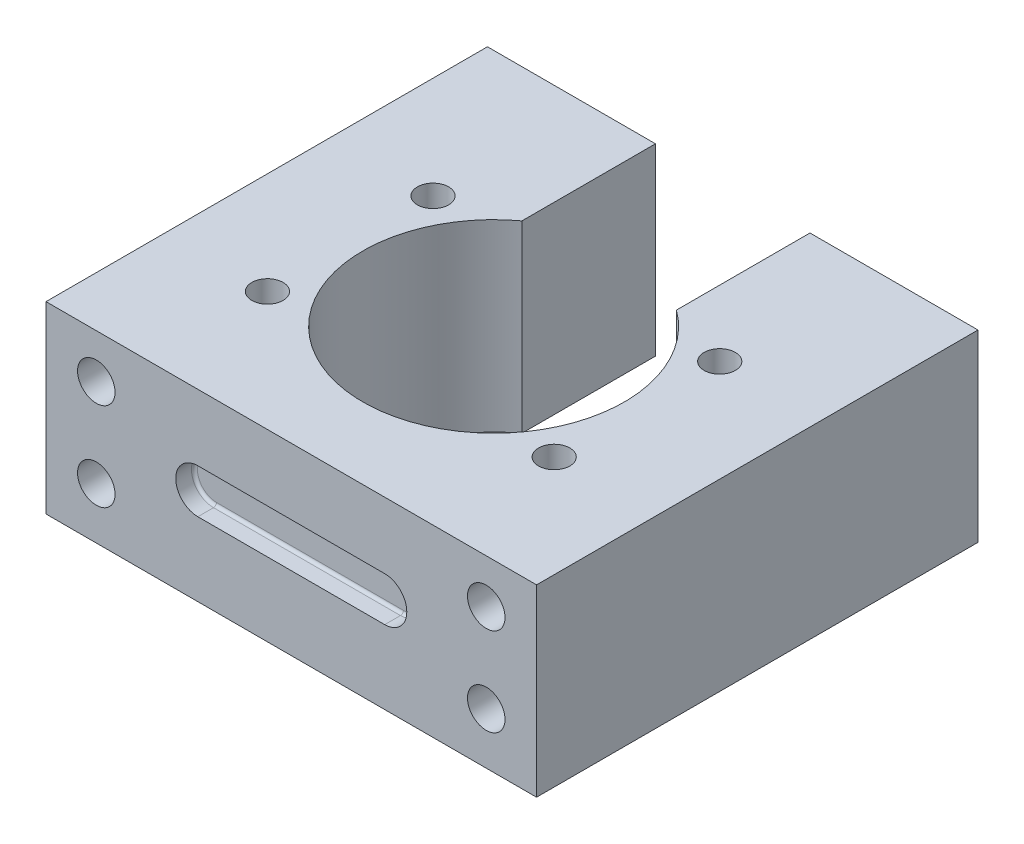
ISO-10303-21;
HEADER;
FILE_DESCRIPTION(('STEP AP214'),'2;1');
FILE_NAME('part.step','',(''),(''),'','','');
FILE_SCHEMA(('AUTOMOTIVE_DESIGN { 1 0 10303 214 1 1 1 1 }'));
ENDSEC;
DATA;
#1=APPLICATION_CONTEXT('core data for automotive mechanical design processes');
#2=APPLICATION_PROTOCOL_DEFINITION('international standard','automotive_design',2000,#1);
#3=PRODUCT_CONTEXT('',#1,'mechanical');
#4=PRODUCT('Part','Part','',(#3));
#5=PRODUCT_RELATED_PRODUCT_CATEGORY('part','',(#4));
#6=PRODUCT_DEFINITION_FORMATION('','',#4);
#7=PRODUCT_DEFINITION_CONTEXT('part definition',#1,'design');
#8=PRODUCT_DEFINITION('design','',#6,#7);
#9=PRODUCT_DEFINITION_SHAPE('','',#8);
#10=(LENGTH_UNIT() NAMED_UNIT(*) SI_UNIT(.MILLI.,.METRE.));
#11=(NAMED_UNIT(*) PLANE_ANGLE_UNIT() SI_UNIT($,.RADIAN.));
#12=(NAMED_UNIT(*) SI_UNIT($,.STERADIAN.) SOLID_ANGLE_UNIT());
#13=UNCERTAINTY_MEASURE_WITH_UNIT(LENGTH_MEASURE(1.E-05),#10,'distance_accuracy_value','');
#14=(GEOMETRIC_REPRESENTATION_CONTEXT(3) GLOBAL_UNCERTAINTY_ASSIGNED_CONTEXT((#13)) GLOBAL_UNIT_ASSIGNED_CONTEXT((#10,
#11,#12)) REPRESENTATION_CONTEXT('',''));
#15=CARTESIAN_POINT('',(0.,0.,0.));
#16=DIRECTION('',(0.,0.,1.));
#17=DIRECTION('',(1.,0.,0.));
#18=AXIS2_PLACEMENT_3D('',#15,#16,#17);
#19=CARTESIAN_POINT('',(0.,28.575,-120.));
#20=DIRECTION('',(0.,0.,-1.));
#21=DIRECTION('',(-1.,0.,0.));
#22=AXIS2_PLACEMENT_3D('',#19,#20,#21);
#23=PLANE('',#22);
#24=DIRECTION('',(0.,1.,0.));
#25=VECTOR('',#24,1.);
#26=CARTESIAN_POINT('',(-21.,-28.575,-120.));
#27=LINE('',#26,#25);
#28=CARTESIAN_POINT('',(-21.,-28.575,-120.));
#29=VERTEX_POINT('',#28);
#30=CARTESIAN_POINT('',(-21.,21.425,-120.));
#31=VERTEX_POINT('',#30);
#32=EDGE_CURVE('E258',#29,#31,#27,.T.);
#33=ORIENTED_EDGE('',*,*,#32,.F.);
#34=DIRECTION('',(1.,0.,0.));
#35=VECTOR('',#34,1.);
#36=CARTESIAN_POINT('',(0.,-28.575,-120.));
#37=LINE('',#36,#35);
#38=CARTESIAN_POINT('',(-66.675,-28.575,-120.));
#39=VERTEX_POINT('',#38);
#40=EDGE_CURVE('E296',#39,#29,#37,.T.);
#41=ORIENTED_EDGE('',*,*,#40,.F.);
#42=DIRECTION('',(0.,-1.,0.));
#43=VECTOR('',#42,1.);
#44=CARTESIAN_POINT('',(-66.675,28.575,-120.));
#45=LINE('',#44,#43);
#46=CARTESIAN_POINT('',(-66.675,21.425,-120.));
#47=VERTEX_POINT('',#46);
#48=EDGE_CURVE('E302',#47,#39,#45,.T.);
#49=ORIENTED_EDGE('',*,*,#48,.F.);
#50=DIRECTION('',(1.,0.,0.));
#51=VECTOR('',#50,1.);
#52=CARTESIAN_POINT('',(-66.675,21.425,-120.));
#53=LINE('',#52,#51);
#54=EDGE_CURVE('E280',#47,#31,#53,.T.);
#55=ORIENTED_EDGE('',*,*,#54,.T.);
#56=EDGE_LOOP('',(#33,#41,#49,#55));
#57=FACE_BOUND('',#56,.T.);
#58=ADVANCED_FACE('F40',(#57),#23,.T.);
#59=CARTESIAN_POINT('',(66.675,28.575,0.));
#60=DIRECTION('',(1.,0.,0.));
#61=DIRECTION('',(0.,0.,-1.));
#62=AXIS2_PLACEMENT_3D('',#59,#60,#61);
#63=PLANE('',#62);
#64=DIRECTION('',(0.,0.,-1.));
#65=VECTOR('',#64,1.);
#66=CARTESIAN_POINT('',(66.675,21.425,0.));
#67=LINE('',#66,#65);
#68=CARTESIAN_POINT('',(66.675,21.425,0.));
#69=VERTEX_POINT('',#68);
#70=CARTESIAN_POINT('',(66.675,21.425,-120.));
#71=VERTEX_POINT('',#70);
#72=EDGE_CURVE('E271',#69,#71,#67,.T.);
#73=ORIENTED_EDGE('',*,*,#72,.F.);
#74=DIRECTION('',(0.,-1.,0.));
#75=VECTOR('',#74,1.);
#76=CARTESIAN_POINT('',(66.675,28.575,0.));
#77=LINE('',#76,#75);
#78=CARTESIAN_POINT('',(66.675,-28.575,0.));
#79=VERTEX_POINT('',#78);
#80=EDGE_CURVE('E290',#69,#79,#77,.T.);
#81=ORIENTED_EDGE('',*,*,#80,.T.);
#82=DIRECTION('',(0.,0.,1.));
#83=VECTOR('',#82,1.);
#84=CARTESIAN_POINT('',(66.675,-28.575,0.));
#85=LINE('',#84,#83);
#86=CARTESIAN_POINT('',(66.675,-28.575,-120.));
#87=VERTEX_POINT('',#86);
#88=EDGE_CURVE('E292',#87,#79,#85,.T.);
#89=ORIENTED_EDGE('',*,*,#88,.F.);
#90=DIRECTION('',(0.,-1.,0.));
#91=VECTOR('',#90,1.);
#92=CARTESIAN_POINT('',(66.675,28.575,-120.));
#93=LINE('',#92,#91);
#94=EDGE_CURVE('E304',#71,#87,#93,.T.);
#95=ORIENTED_EDGE('',*,*,#94,.F.);
#96=EDGE_LOOP('',(#73,#81,#89,#95));
#97=FACE_BOUND('',#96,.T.);
#98=ADVANCED_FACE('F351',(#97),#63,.T.);
#99=DIRECTION('',(0.,1.,0.));
#100=VECTOR('',#99,1.);
#101=CARTESIAN_POINT('',(21.,-28.575,-120.));
#102=LINE('',#101,#100);
#103=CARTESIAN_POINT('',(21.,-28.575,-120.));
#104=VERTEX_POINT('',#103);
#105=CARTESIAN_POINT('',(21.,21.425,-120.));
#106=VERTEX_POINT('',#105);
#107=EDGE_CURVE('E261',#104,#106,#102,.T.);
#108=ORIENTED_EDGE('',*,*,#107,.T.);
#109=EDGE_CURVE('E284',#106,#71,#53,.T.);
#110=ORIENTED_EDGE('',*,*,#109,.T.);
#111=ORIENTED_EDGE('',*,*,#94,.T.);
#112=EDGE_CURVE('E295',#104,#87,#37,.T.);
#113=ORIENTED_EDGE('',*,*,#112,.F.);
#114=EDGE_LOOP('',(#108,#110,#111,#113));
#115=FACE_BOUND('',#114,.T.);
#116=ADVANCED_FACE('F354',(#115),#23,.T.);
#117=CARTESIAN_POINT('',(-66.675,28.575,0.));
#118=DIRECTION('',(1.,0.,0.));
#119=DIRECTION('',(0.,0.,-1.));
#120=AXIS2_PLACEMENT_3D('',#117,#118,#119);
#121=PLANE('',#120);
#122=DIRECTION('',(0.,-1.,0.));
#123=VECTOR('',#122,1.);
#124=CARTESIAN_POINT('',(-66.675,28.575,0.));
#125=LINE('',#124,#123);
#126=CARTESIAN_POINT('',(-66.675,21.425,0.));
#127=VERTEX_POINT('',#126);
#128=CARTESIAN_POINT('',(-66.675,-28.575,0.));
#129=VERTEX_POINT('',#128);
#130=EDGE_CURVE('E288',#127,#129,#125,.T.);
#131=ORIENTED_EDGE('',*,*,#130,.F.);
#132=DIRECTION('',(0.,0.,-1.));
#133=VECTOR('',#132,1.);
#134=CARTESIAN_POINT('',(-66.675,21.425,0.));
#135=LINE('',#134,#133);
#136=EDGE_CURVE('E274',#127,#47,#135,.T.);
#137=ORIENTED_EDGE('',*,*,#136,.T.);
#138=ORIENTED_EDGE('',*,*,#48,.T.);
#139=DIRECTION('',(0.,0.,1.));
#140=VECTOR('',#139,1.);
#141=CARTESIAN_POINT('',(-66.675,-28.575,0.));
#142=LINE('',#141,#140);
#143=EDGE_CURVE('E299',#39,#129,#142,.T.);
#144=ORIENTED_EDGE('',*,*,#143,.T.);
#145=EDGE_LOOP('',(#131,#137,#138,#144));
#146=FACE_BOUND('',#145,.T.);
#147=ADVANCED_FACE('F363',(#146),#121,.F.);
#148=CARTESIAN_POINT('',(0.,-28.575,0.));
#149=DIRECTION('',(0.,1.,0.));
#150=DIRECTION('',(0.,0.,1.));
#151=AXIS2_PLACEMENT_3D('',#148,#149,#150);
#152=PLANE('',#151);
#153=ORIENTED_EDGE('',*,*,#40,.T.);
#154=DIRECTION('',(0.,0.,1.));
#155=VECTOR('',#154,1.);
#156=CARTESIAN_POINT('',(-21.,-28.575,-120.));
#157=LINE('',#156,#155);
#158=CARTESIAN_POINT('',(-21.,-28.575,-83.6969266647145));
#159=VERTEX_POINT('',#158);
#160=EDGE_CURVE('E248',#29,#159,#157,.T.);
#161=ORIENTED_EDGE('',*,*,#160,.T.);
#162=CARTESIAN_POINT('',(0.,-28.575,-55.));
#163=DIRECTION('',(0.,1.,0.));
#164=DIRECTION('',(0.,0.,1.));
#165=AXIS2_PLACEMENT_3D('',#162,#163,#164);
#166=CIRCLE('',#165,35.56);
#167=CARTESIAN_POINT('',(21.,-28.575,-83.6969266647145));
#168=VERTEX_POINT('',#167);
#169=EDGE_CURVE('E268',#159,#168,#166,.T.);
#170=ORIENTED_EDGE('',*,*,#169,.T.);
#171=DIRECTION('',(0.,0.,-1.));
#172=VECTOR('',#171,1.);
#173=CARTESIAN_POINT('',(21.,-28.575,-120.));
#174=LINE('',#173,#172);
#175=EDGE_CURVE('E251',#168,#104,#174,.T.);
#176=ORIENTED_EDGE('',*,*,#175,.T.);
#177=ORIENTED_EDGE('',*,*,#112,.T.);
#178=ORIENTED_EDGE('',*,*,#88,.T.);
#179=DIRECTION('',(1.,0.,0.));
#180=VECTOR('',#179,1.);
#181=CARTESIAN_POINT('',(0.,-28.575,0.));
#182=LINE('',#181,#180);
#183=EDGE_CURVE('E283',#129,#79,#182,.T.);
#184=ORIENTED_EDGE('',*,*,#183,.F.);
#185=ORIENTED_EDGE('',*,*,#143,.F.);
#186=EDGE_LOOP('',(#153,#161,#170,#176,#177,#178,#184,#185));
#187=FACE_BOUND('',#186,.T.);
#188=ADVANCED_FACE('F368',(#187),#152,.F.);
#189=CARTESIAN_POINT('',(0.,28.575,0.));
#190=DIRECTION('',(0.,0.,-1.));
#191=DIRECTION('',(-1.,0.,0.));
#192=AXIS2_PLACEMENT_3D('',#189,#190,#191);
#193=PLANE('',#192);
#194=DIRECTION('',(1.,0.,0.));
#195=VECTOR('',#194,1.);
#196=CARTESIAN_POINT('',(-25.4,-8.57500000000001,0.));
#197=LINE('',#196,#195);
#198=CARTESIAN_POINT('',(-25.4,-8.57500000000001,0.));
#199=VERTEX_POINT('',#198);
#200=CARTESIAN_POINT('',(25.4,-8.575,0.));
#201=VERTEX_POINT('',#200);
#202=EDGE_CURVE('E180',#199,#201,#197,.T.);
#203=ORIENTED_EDGE('',*,*,#202,.F.);
#204=CARTESIAN_POINT('',(-25.4,-2.57500000000001,0.));
#205=DIRECTION('',(0.,0.,1.));
#206=DIRECTION('',(1.,0.,0.));
#207=AXIS2_PLACEMENT_3D('',#204,#205,#206);
#208=CIRCLE('',#207,6.);
#209=CARTESIAN_POINT('',(-25.4,3.425,0.));
#210=VERTEX_POINT('',#209);
#211=EDGE_CURVE('E185',#210,#199,#208,.T.);
#212=ORIENTED_EDGE('',*,*,#211,.F.);
#213=DIRECTION('',(-1.,0.,0.));
#214=VECTOR('',#213,1.);
#215=CARTESIAN_POINT('',(-25.4,3.425,0.));
#216=LINE('',#215,#214);
#217=CARTESIAN_POINT('',(25.4,3.425,0.));
#218=VERTEX_POINT('',#217);
#219=EDGE_CURVE('E190',#218,#210,#216,.T.);
#220=ORIENTED_EDGE('',*,*,#219,.F.);
#221=CARTESIAN_POINT('',(25.4,-2.575,0.));
#222=DIRECTION('',(0.,0.,1.));
#223=DIRECTION('',(1.,0.,0.));
#224=AXIS2_PLACEMENT_3D('',#221,#222,#223);
#225=CIRCLE('',#224,6.);
#226=EDGE_CURVE('E170',#201,#218,#225,.T.);
#227=ORIENTED_EDGE('',*,*,#226,.F.);
#228=EDGE_LOOP('',(#203,#212,#220,#227));
#229=FACE_BOUND('',#228,.T.);
#230=CARTESIAN_POINT('',(-53.,9.425,0.));
#231=DIRECTION('',(0.,0.,1.));
#232=DIRECTION('',(1.,0.,0.));
#233=AXIS2_PLACEMENT_3D('',#230,#231,#232);
#234=CIRCLE('',#233,5.09999999999999);
#235=CARTESIAN_POINT('',(-47.9,9.425,0.));
#236=VERTEX_POINT('',#235);
#237=EDGE_CURVE('E197',#236,#236,#234,.T.);
#238=ORIENTED_EDGE('',*,*,#237,.F.);
#239=EDGE_LOOP('',(#238));
#240=FACE_BOUND('',#239,.T.);
#241=CARTESIAN_POINT('',(-53.,-14.575,0.));
#242=DIRECTION('',(0.,0.,1.));
#243=DIRECTION('',(1.,0.,0.));
#244=AXIS2_PLACEMENT_3D('',#241,#242,#243);
#245=CIRCLE('',#244,5.09999999999999);
#246=CARTESIAN_POINT('',(-47.9,-14.575,0.));
#247=VERTEX_POINT('',#246);
#248=EDGE_CURVE('E205',#247,#247,#245,.T.);
#249=ORIENTED_EDGE('',*,*,#248,.F.);
#250=EDGE_LOOP('',(#249));
#251=FACE_BOUND('',#250,.T.);
#252=CARTESIAN_POINT('',(53.,9.425,0.));
#253=DIRECTION('',(0.,0.,1.));
#254=DIRECTION('',(1.,0.,0.));
#255=AXIS2_PLACEMENT_3D('',#252,#253,#254);
#256=CIRCLE('',#255,5.09999999999999);
#257=CARTESIAN_POINT('',(58.1,9.425,0.));
#258=VERTEX_POINT('',#257);
#259=EDGE_CURVE('E211',#258,#258,#256,.T.);
#260=ORIENTED_EDGE('',*,*,#259,.F.);
#261=EDGE_LOOP('',(#260));
#262=FACE_BOUND('',#261,.T.);
#263=CARTESIAN_POINT('',(53.,-14.575,0.));
#264=DIRECTION('',(0.,0.,1.));
#265=DIRECTION('',(1.,0.,0.));
#266=AXIS2_PLACEMENT_3D('',#263,#264,#265);
#267=CIRCLE('',#266,5.09999999999999);
#268=CARTESIAN_POINT('',(58.1,-14.575,0.));
#269=VERTEX_POINT('',#268);
#270=EDGE_CURVE('E217',#269,#269,#267,.T.);
#271=ORIENTED_EDGE('',*,*,#270,.F.);
#272=EDGE_LOOP('',(#271));
#273=FACE_BOUND('',#272,.T.);
#274=ORIENTED_EDGE('',*,*,#80,.F.);
#275=DIRECTION('',(1.,0.,0.));
#276=VECTOR('',#275,1.);
#277=CARTESIAN_POINT('',(-66.675,21.425,0.));
#278=LINE('',#277,#276);
#279=EDGE_CURVE('E277',#127,#69,#278,.T.);
#280=ORIENTED_EDGE('',*,*,#279,.F.);
#281=ORIENTED_EDGE('',*,*,#130,.T.);
#282=ORIENTED_EDGE('',*,*,#183,.T.);
#283=EDGE_LOOP('',(#274,#280,#281,#282));
#284=FACE_BOUND('',#283,.T.);
#285=ADVANCED_FACE('F187',(#229,#240,#251,#262,#273,#284),#193,.F.);
#286=CARTESIAN_POINT('',(-66.675,21.425,0.));
#287=DIRECTION('',(0.,-1.,0.));
#288=DIRECTION('',(0.,0.,-1.));
#289=AXIS2_PLACEMENT_3D('',#286,#287,#288);
#290=PLANE('',#289);
#291=CARTESIAN_POINT('',(-38.9711431702999,21.425,-77.4999999999998));
#292=DIRECTION('',(0.,1.,0.));
#293=DIRECTION('',(0.,0.,1.));
#294=AXIS2_PLACEMENT_3D('',#291,#292,#293);
#295=CIRCLE('',#294,4.25);
#296=CARTESIAN_POINT('',(-38.9711431702999,21.425,-73.2499999999998));
#297=VERTEX_POINT('',#296);
#298=EDGE_CURVE('E223',#297,#297,#295,.T.);
#299=ORIENTED_EDGE('',*,*,#298,.F.);
#300=EDGE_LOOP('',(#299));
#301=FACE_BOUND('',#300,.T.);
#302=CARTESIAN_POINT('',(-38.9711431702999,21.425,-32.5000000000002));
#303=DIRECTION('',(0.,1.,0.));
#304=DIRECTION('',(0.,0.,1.));
#305=AXIS2_PLACEMENT_3D('',#302,#303,#304);
#306=CIRCLE('',#305,4.25);
#307=CARTESIAN_POINT('',(-38.9711431702999,21.425,-28.2500000000002));
#308=VERTEX_POINT('',#307);
#309=EDGE_CURVE('E229',#308,#308,#306,.T.);
#310=ORIENTED_EDGE('',*,*,#309,.F.);
#311=EDGE_LOOP('',(#310));
#312=FACE_BOUND('',#311,.T.);
#313=CARTESIAN_POINT('',(38.9711431702999,21.425,-77.4999999999998));
#314=DIRECTION('',(0.,1.,0.));
#315=DIRECTION('',(0.,0.,1.));
#316=AXIS2_PLACEMENT_3D('',#313,#314,#315);
#317=CIRCLE('',#316,4.25);
#318=CARTESIAN_POINT('',(38.9711431702999,21.425,-73.2499999999998));
#319=VERTEX_POINT('',#318);
#320=EDGE_CURVE('E235',#319,#319,#317,.T.);
#321=ORIENTED_EDGE('',*,*,#320,.F.);
#322=EDGE_LOOP('',(#321));
#323=FACE_BOUND('',#322,.T.);
#324=CARTESIAN_POINT('',(38.9711431702999,21.425,-32.5000000000002));
#325=DIRECTION('',(0.,1.,0.));
#326=DIRECTION('',(0.,0.,1.));
#327=AXIS2_PLACEMENT_3D('',#324,#325,#326);
#328=CIRCLE('',#327,4.25);
#329=CARTESIAN_POINT('',(38.9711431702999,21.425,-28.2500000000002));
#330=VERTEX_POINT('',#329);
#331=EDGE_CURVE('E241',#330,#330,#328,.T.);
#332=ORIENTED_EDGE('',*,*,#331,.F.);
#333=EDGE_LOOP('',(#332));
#334=FACE_BOUND('',#333,.T.);
#335=CARTESIAN_POINT('',(0.,21.425,-55.));
#336=DIRECTION('',(0.,1.,0.));
#337=DIRECTION('',(0.,0.,1.));
#338=AXIS2_PLACEMENT_3D('',#335,#336,#337);
#339=CIRCLE('',#338,35.56);
#340=CARTESIAN_POINT('',(-21.,21.425,-83.6969266647145));
#341=VERTEX_POINT('',#340);
#342=CARTESIAN_POINT('',(21.,21.425,-83.6969266647145));
#343=VERTEX_POINT('',#342);
#344=EDGE_CURVE('E260',#341,#343,#339,.T.);
#345=ORIENTED_EDGE('',*,*,#344,.F.);
#346=DIRECTION('',(0.,0.,1.));
#347=VECTOR('',#346,1.);
#348=CARTESIAN_POINT('',(-21.,21.425,-120.));
#349=LINE('',#348,#347);
#350=EDGE_CURVE('E247',#31,#341,#349,.T.);
#351=ORIENTED_EDGE('',*,*,#350,.F.);
#352=ORIENTED_EDGE('',*,*,#54,.F.);
#353=ORIENTED_EDGE('',*,*,#136,.F.);
#354=ORIENTED_EDGE('',*,*,#279,.T.);
#355=ORIENTED_EDGE('',*,*,#72,.T.);
#356=ORIENTED_EDGE('',*,*,#109,.F.);
#357=DIRECTION('',(0.,0.,-1.));
#358=VECTOR('',#357,1.);
#359=CARTESIAN_POINT('',(21.,21.425,-120.));
#360=LINE('',#359,#358);
#361=EDGE_CURVE('E252',#343,#106,#360,.T.);
#362=ORIENTED_EDGE('',*,*,#361,.F.);
#363=EDGE_LOOP('',(#345,#351,#352,#353,#354,#355,#356,#362));
#364=FACE_BOUND('',#363,.T.);
#365=ADVANCED_FACE('F376',(#301,#312,#323,#334,#364),#290,.F.);
#366=CARTESIAN_POINT('',(0.,-28.575,-55.));
#367=DIRECTION('',(0.,1.,0.));
#368=DIRECTION('',(0.,0.,1.));
#369=AXIS2_PLACEMENT_3D('',#366,#367,#368);
#370=CYLINDRICAL_SURFACE('',#369,35.56);
#371=ORIENTED_EDGE('',*,*,#344,.T.);
#372=DIRECTION('',(0.,1.,0.));
#373=VECTOR('',#372,1.);
#374=CARTESIAN_POINT('',(21.,-28.575,-83.6969266647145));
#375=LINE('',#374,#373);
#376=EDGE_CURVE('E264',#168,#343,#375,.T.);
#377=ORIENTED_EDGE('',*,*,#376,.F.);
#378=ORIENTED_EDGE('',*,*,#169,.F.);
#379=DIRECTION('',(0.,1.,0.));
#380=VECTOR('',#379,1.);
#381=CARTESIAN_POINT('',(-21.,-28.575,-83.6969266647145));
#382=LINE('',#381,#380);
#383=EDGE_CURVE('E255',#159,#341,#382,.T.);
#384=ORIENTED_EDGE('',*,*,#383,.T.);
#385=EDGE_LOOP('',(#371,#377,#378,#384));
#386=FACE_BOUND('',#385,.T.);
#387=ADVANCED_FACE('F389',(#386),#370,.F.);
#388=CARTESIAN_POINT('',(-21.,-28.575,-120.));
#389=DIRECTION('',(-1.,0.,0.));
#390=DIRECTION('',(0.,-1.,0.));
#391=AXIS2_PLACEMENT_3D('',#388,#389,#390);
#392=PLANE('',#391);
#393=ORIENTED_EDGE('',*,*,#350,.T.);
#394=ORIENTED_EDGE('',*,*,#383,.F.);
#395=ORIENTED_EDGE('',*,*,#160,.F.);
#396=ORIENTED_EDGE('',*,*,#32,.T.);
#397=EDGE_LOOP('',(#393,#394,#395,#396));
#398=FACE_BOUND('',#397,.T.);
#399=ADVANCED_FACE('F395',(#398),#392,.F.);
#400=CARTESIAN_POINT('',(21.,-28.575,-120.));
#401=DIRECTION('',(1.,0.,0.));
#402=DIRECTION('',(0.,1.,0.));
#403=AXIS2_PLACEMENT_3D('',#400,#401,#402);
#404=PLANE('',#403);
#405=ORIENTED_EDGE('',*,*,#361,.T.);
#406=ORIENTED_EDGE('',*,*,#107,.F.);
#407=ORIENTED_EDGE('',*,*,#175,.F.);
#408=ORIENTED_EDGE('',*,*,#376,.T.);
#409=EDGE_LOOP('',(#405,#406,#407,#408));
#410=FACE_BOUND('',#409,.T.);
#411=ADVANCED_FACE('F387',(#410),#404,.F.);
#412=CARTESIAN_POINT('',(38.9711431702999,-6.075,-32.5000000000002));
#413=DIRECTION('',(0.,1.,0.));
#414=DIRECTION('',(0.,0.,1.));
#415=AXIS2_PLACEMENT_3D('',#412,#413,#414);
#416=CONICAL_SURFACE('',#415,4.24999999999999,1.02974425867665);
#417=CARTESIAN_POINT('',(38.9711431702999,-8.62865763086713,-32.5000000000002));
#418=VERTEX_POINT('',#417);
#419=VERTEX_LOOP('',#418);
#420=FACE_BOUND('',#419,.T.);
#421=CARTESIAN_POINT('',(38.9711431702999,-6.075,-32.5000000000002));
#422=DIRECTION('',(0.,1.,0.));
#423=DIRECTION('',(0.,0.,1.));
#424=AXIS2_PLACEMENT_3D('',#421,#422,#423);
#425=CIRCLE('',#424,4.24999999999999);
#426=CARTESIAN_POINT('',(38.9711431702999,-6.075,-28.2500000000002));
#427=VERTEX_POINT('',#426);
#428=EDGE_CURVE('E244',#427,#427,#425,.T.);
#429=ORIENTED_EDGE('',*,*,#428,.T.);
#430=EDGE_LOOP('',(#429));
#431=FACE_BOUND('',#430,.T.);
#432=ADVANCED_FACE('F402',(#420,#431),#416,.F.);
#433=CARTESIAN_POINT('',(38.9711431702999,21.425,-32.5000000000002));
#434=DIRECTION('',(0.,1.,0.));
#435=DIRECTION('',(0.,0.,1.));
#436=AXIS2_PLACEMENT_3D('',#433,#434,#435);
#437=CYLINDRICAL_SURFACE('',#436,4.24999999999999);
#438=ORIENTED_EDGE('',*,*,#428,.F.);
#439=EDGE_LOOP('',(#438));
#440=FACE_BOUND('',#439,.T.);
#441=ORIENTED_EDGE('',*,*,#331,.T.);
#442=EDGE_LOOP('',(#441));
#443=FACE_BOUND('',#442,.T.);
#444=ADVANCED_FACE('F451',(#440,#443),#437,.F.);
#445=CARTESIAN_POINT('',(38.9711431702999,-6.075,-77.4999999999998));
#446=DIRECTION('',(0.,1.,0.));
#447=DIRECTION('',(0.,0.,1.));
#448=AXIS2_PLACEMENT_3D('',#445,#446,#447);
#449=CONICAL_SURFACE('',#448,4.24999999999999,1.02974425867665);
#450=CARTESIAN_POINT('',(38.9711431702999,-8.62865763086713,-77.4999999999998));
#451=VERTEX_POINT('',#450);
#452=VERTEX_LOOP('',#451);
#453=FACE_BOUND('',#452,.T.);
#454=CARTESIAN_POINT('',(38.9711431702999,-6.075,-77.4999999999998));
#455=DIRECTION('',(0.,1.,0.));
#456=DIRECTION('',(0.,0.,1.));
#457=AXIS2_PLACEMENT_3D('',#454,#455,#456);
#458=CIRCLE('',#457,4.24999999999999);
#459=CARTESIAN_POINT('',(38.9711431702999,-6.075,-73.2499999999998));
#460=VERTEX_POINT('',#459);
#461=EDGE_CURVE('E238',#460,#460,#458,.T.);
#462=ORIENTED_EDGE('',*,*,#461,.T.);
#463=EDGE_LOOP('',(#462));
#464=FACE_BOUND('',#463,.T.);
#465=ADVANCED_FACE('F458',(#453,#464),#449,.F.);
#466=CARTESIAN_POINT('',(38.9711431702999,21.425,-77.4999999999998));
#467=DIRECTION('',(0.,1.,0.));
#468=DIRECTION('',(0.,0.,1.));
#469=AXIS2_PLACEMENT_3D('',#466,#467,#468);
#470=CYLINDRICAL_SURFACE('',#469,4.24999999999999);
#471=ORIENTED_EDGE('',*,*,#461,.F.);
#472=EDGE_LOOP('',(#471));
#473=FACE_BOUND('',#472,.T.);
#474=ORIENTED_EDGE('',*,*,#320,.T.);
#475=EDGE_LOOP('',(#474));
#476=FACE_BOUND('',#475,.T.);
#477=ADVANCED_FACE('F467',(#473,#476),#470,.F.);
#478=CARTESIAN_POINT('',(-38.9711431702999,-6.075,-32.5000000000002));
#479=DIRECTION('',(0.,1.,0.));
#480=DIRECTION('',(0.,0.,1.));
#481=AXIS2_PLACEMENT_3D('',#478,#479,#480);
#482=CONICAL_SURFACE('',#481,4.24999999999999,1.02974425867665);
#483=CARTESIAN_POINT('',(-38.9711431702999,-8.62865763086713,-32.5000000000002));
#484=VERTEX_POINT('',#483);
#485=VERTEX_LOOP('',#484);
#486=FACE_BOUND('',#485,.T.);
#487=CARTESIAN_POINT('',(-38.9711431702999,-6.075,-32.5000000000002));
#488=DIRECTION('',(0.,1.,0.));
#489=DIRECTION('',(0.,0.,1.));
#490=AXIS2_PLACEMENT_3D('',#487,#488,#489);
#491=CIRCLE('',#490,4.24999999999999);
#492=CARTESIAN_POINT('',(-38.9711431702999,-6.075,-28.2500000000002));
#493=VERTEX_POINT('',#492);
#494=EDGE_CURVE('E232',#493,#493,#491,.T.);
#495=ORIENTED_EDGE('',*,*,#494,.T.);
#496=EDGE_LOOP('',(#495));
#497=FACE_BOUND('',#496,.T.);
#498=ADVANCED_FACE('F475',(#486,#497),#482,.F.);
#499=CARTESIAN_POINT('',(-38.9711431702999,21.425,-32.5000000000002));
#500=DIRECTION('',(0.,1.,0.));
#501=DIRECTION('',(0.,0.,1.));
#502=AXIS2_PLACEMENT_3D('',#499,#500,#501);
#503=CYLINDRICAL_SURFACE('',#502,4.24999999999999);
#504=ORIENTED_EDGE('',*,*,#494,.F.);
#505=EDGE_LOOP('',(#504));
#506=FACE_BOUND('',#505,.T.);
#507=ORIENTED_EDGE('',*,*,#309,.T.);
#508=EDGE_LOOP('',(#507));
#509=FACE_BOUND('',#508,.T.);
#510=ADVANCED_FACE('F484',(#506,#509),#503,.F.);
#511=CARTESIAN_POINT('',(-38.9711431702999,-6.075,-77.4999999999998));
#512=DIRECTION('',(0.,1.,0.));
#513=DIRECTION('',(0.,0.,1.));
#514=AXIS2_PLACEMENT_3D('',#511,#512,#513);
#515=CONICAL_SURFACE('',#514,4.24999999999999,1.02974425867665);
#516=CARTESIAN_POINT('',(-38.9711431702999,-8.62865763086713,-77.4999999999998));
#517=VERTEX_POINT('',#516);
#518=VERTEX_LOOP('',#517);
#519=FACE_BOUND('',#518,.T.);
#520=CARTESIAN_POINT('',(-38.9711431702999,-6.075,-77.4999999999998));
#521=DIRECTION('',(0.,1.,0.));
#522=DIRECTION('',(0.,0.,1.));
#523=AXIS2_PLACEMENT_3D('',#520,#521,#522);
#524=CIRCLE('',#523,4.24999999999999);
#525=CARTESIAN_POINT('',(-38.9711431702999,-6.075,-73.2499999999998));
#526=VERTEX_POINT('',#525);
#527=EDGE_CURVE('E226',#526,#526,#524,.T.);
#528=ORIENTED_EDGE('',*,*,#527,.T.);
#529=EDGE_LOOP('',(#528));
#530=FACE_BOUND('',#529,.T.);
#531=ADVANCED_FACE('F492',(#519,#530),#515,.F.);
#532=CARTESIAN_POINT('',(-38.9711431702999,21.425,-77.4999999999998));
#533=DIRECTION('',(0.,1.,0.));
#534=DIRECTION('',(0.,0.,1.));
#535=AXIS2_PLACEMENT_3D('',#532,#533,#534);
#536=CYLINDRICAL_SURFACE('',#535,4.24999999999999);
#537=ORIENTED_EDGE('',*,*,#527,.F.);
#538=EDGE_LOOP('',(#537));
#539=FACE_BOUND('',#538,.T.);
#540=ORIENTED_EDGE('',*,*,#298,.T.);
#541=EDGE_LOOP('',(#540));
#542=FACE_BOUND('',#541,.T.);
#543=ADVANCED_FACE('F501',(#539,#542),#536,.F.);
#544=CARTESIAN_POINT('',(53.,-14.575,-43.99));
#545=DIRECTION('',(0.,0.,1.));
#546=DIRECTION('',(1.,0.,0.));
#547=AXIS2_PLACEMENT_3D('',#544,#545,#546);
#548=CONICAL_SURFACE('',#547,5.09999999999999,1.02974425867665);
#549=CARTESIAN_POINT('',(53.,-14.575,-47.0543891570406));
#550=VERTEX_POINT('',#549);
#551=VERTEX_LOOP('',#550);
#552=FACE_BOUND('',#551,.T.);
#553=CARTESIAN_POINT('',(53.,-14.575,-43.99));
#554=DIRECTION('',(0.,0.,1.));
#555=DIRECTION('',(1.,0.,0.));
#556=AXIS2_PLACEMENT_3D('',#553,#554,#555);
#557=CIRCLE('',#556,5.09999999999999);
#558=CARTESIAN_POINT('',(58.1,-14.575,-43.99));
#559=VERTEX_POINT('',#558);
#560=EDGE_CURVE('E220',#559,#559,#557,.T.);
#561=ORIENTED_EDGE('',*,*,#560,.T.);
#562=EDGE_LOOP('',(#561));
#563=FACE_BOUND('',#562,.T.);
#564=ADVANCED_FACE('F509',(#552,#563),#548,.F.);
#565=CARTESIAN_POINT('',(53.,-14.575,0.));
#566=DIRECTION('',(0.,0.,1.));
#567=DIRECTION('',(1.,0.,0.));
#568=AXIS2_PLACEMENT_3D('',#565,#566,#567);
#569=CYLINDRICAL_SURFACE('',#568,5.09999999999999);
#570=ORIENTED_EDGE('',*,*,#560,.F.);
#571=EDGE_LOOP('',(#570));
#572=FACE_BOUND('',#571,.T.);
#573=ORIENTED_EDGE('',*,*,#270,.T.);
#574=EDGE_LOOP('',(#573));
#575=FACE_BOUND('',#574,.T.);
#576=ADVANCED_FACE('F518',(#572,#575),#569,.F.);
#577=CARTESIAN_POINT('',(53.,9.425,-43.99));
#578=DIRECTION('',(0.,0.,1.));
#579=DIRECTION('',(1.,0.,0.));
#580=AXIS2_PLACEMENT_3D('',#577,#578,#579);
#581=CONICAL_SURFACE('',#580,5.09999999999999,1.02974425867665);
#582=CARTESIAN_POINT('',(53.,9.425,-47.0543891570406));
#583=VERTEX_POINT('',#582);
#584=VERTEX_LOOP('',#583);
#585=FACE_BOUND('',#584,.T.);
#586=CARTESIAN_POINT('',(53.,9.425,-43.99));
#587=DIRECTION('',(0.,0.,1.));
#588=DIRECTION('',(1.,0.,0.));
#589=AXIS2_PLACEMENT_3D('',#586,#587,#588);
#590=CIRCLE('',#589,5.09999999999999);
#591=CARTESIAN_POINT('',(58.1,9.425,-43.99));
#592=VERTEX_POINT('',#591);
#593=EDGE_CURVE('E214',#592,#592,#590,.T.);
#594=ORIENTED_EDGE('',*,*,#593,.T.);
#595=EDGE_LOOP('',(#594));
#596=FACE_BOUND('',#595,.T.);
#597=ADVANCED_FACE('F526',(#585,#596),#581,.F.);
#598=CARTESIAN_POINT('',(53.,9.425,0.));
#599=DIRECTION('',(0.,0.,1.));
#600=DIRECTION('',(1.,0.,0.));
#601=AXIS2_PLACEMENT_3D('',#598,#599,#600);
#602=CYLINDRICAL_SURFACE('',#601,5.09999999999999);
#603=ORIENTED_EDGE('',*,*,#593,.F.);
#604=EDGE_LOOP('',(#603));
#605=FACE_BOUND('',#604,.T.);
#606=ORIENTED_EDGE('',*,*,#259,.T.);
#607=EDGE_LOOP('',(#606));
#608=FACE_BOUND('',#607,.T.);
#609=ADVANCED_FACE('F535',(#605,#608),#602,.F.);
#610=CARTESIAN_POINT('',(-53.,-14.575,-43.99));
#611=DIRECTION('',(0.,0.,1.));
#612=DIRECTION('',(1.,0.,0.));
#613=AXIS2_PLACEMENT_3D('',#610,#611,#612);
#614=CONICAL_SURFACE('',#613,5.09999999999999,1.02974425867665);
#615=CARTESIAN_POINT('',(-53.,-14.575,-47.0543891570406));
#616=VERTEX_POINT('',#615);
#617=VERTEX_LOOP('',#616);
#618=FACE_BOUND('',#617,.T.);
#619=CARTESIAN_POINT('',(-53.,-14.575,-43.99));
#620=DIRECTION('',(0.,0.,1.));
#621=DIRECTION('',(1.,0.,0.));
#622=AXIS2_PLACEMENT_3D('',#619,#620,#621);
#623=CIRCLE('',#622,5.09999999999999);
#624=CARTESIAN_POINT('',(-47.9,-14.575,-43.99));
#625=VERTEX_POINT('',#624);
#626=EDGE_CURVE('E208',#625,#625,#623,.T.);
#627=ORIENTED_EDGE('',*,*,#626,.T.);
#628=EDGE_LOOP('',(#627));
#629=FACE_BOUND('',#628,.T.);
#630=ADVANCED_FACE('F543',(#618,#629),#614,.F.);
#631=CARTESIAN_POINT('',(-53.,-14.575,0.));
#632=DIRECTION('',(0.,0.,1.));
#633=DIRECTION('',(1.,0.,0.));
#634=AXIS2_PLACEMENT_3D('',#631,#632,#633);
#635=CYLINDRICAL_SURFACE('',#634,5.09999999999999);
#636=ORIENTED_EDGE('',*,*,#626,.F.);
#637=EDGE_LOOP('',(#636));
#638=FACE_BOUND('',#637,.T.);
#639=ORIENTED_EDGE('',*,*,#248,.T.);
#640=EDGE_LOOP('',(#639));
#641=FACE_BOUND('',#640,.T.);
#642=ADVANCED_FACE('F552',(#638,#641),#635,.F.);
#643=CARTESIAN_POINT('',(-53.,9.425,-43.99));
#644=DIRECTION('',(0.,0.,1.));
#645=DIRECTION('',(1.,0.,0.));
#646=AXIS2_PLACEMENT_3D('',#643,#644,#645);
#647=CONICAL_SURFACE('',#646,5.09999999999999,1.02974425867665);
#648=CARTESIAN_POINT('',(-53.,9.425,-47.0543891570406));
#649=VERTEX_POINT('',#648);
#650=VERTEX_LOOP('',#649);
#651=FACE_BOUND('',#650,.T.);
#652=CARTESIAN_POINT('',(-53.,9.425,-43.99));
#653=DIRECTION('',(0.,0.,1.));
#654=DIRECTION('',(1.,0.,0.));
#655=AXIS2_PLACEMENT_3D('',#652,#653,#654);
#656=CIRCLE('',#655,5.09999999999999);
#657=CARTESIAN_POINT('',(-47.9,9.425,-43.99));
#658=VERTEX_POINT('',#657);
#659=EDGE_CURVE('E202',#658,#658,#656,.T.);
#660=ORIENTED_EDGE('',*,*,#659,.T.);
#661=EDGE_LOOP('',(#660));
#662=FACE_BOUND('',#661,.T.);
#663=ADVANCED_FACE('F560',(#651,#662),#647,.F.);
#664=CARTESIAN_POINT('',(-53.,9.425,0.));
#665=DIRECTION('',(0.,0.,1.));
#666=DIRECTION('',(1.,0.,0.));
#667=AXIS2_PLACEMENT_3D('',#664,#665,#666);
#668=CYLINDRICAL_SURFACE('',#667,5.09999999999999);
#669=ORIENTED_EDGE('',*,*,#659,.F.);
#670=EDGE_LOOP('',(#669));
#671=FACE_BOUND('',#670,.T.);
#672=ORIENTED_EDGE('',*,*,#237,.T.);
#673=EDGE_LOOP('',(#672));
#674=FACE_BOUND('',#673,.T.);
#675=ADVANCED_FACE('F569',(#671,#674),#668,.F.);
#676=CARTESIAN_POINT('',(-25.4,-2.57500000000001,-5.08));
#677=DIRECTION('',(0.,0.,1.));
#678=DIRECTION('',(1.,0.,0.));
#679=AXIS2_PLACEMENT_3D('',#676,#677,#678);
#680=CYLINDRICAL_SURFACE('',#679,6.);
#681=DIRECTION('',(0.,0.,1.));
#682=VECTOR('',#681,1.);
#683=CARTESIAN_POINT('',(-25.4,-8.57500000000001,-5.08));
#684=LINE('',#683,#682);
#685=CARTESIAN_POINT('',(-25.4,-8.57500000000001,-4.2672));
#686=VERTEX_POINT('',#685);
#687=EDGE_CURVE('E177',#686,#199,#684,.T.);
#688=ORIENTED_EDGE('',*,*,#687,.F.);
#689=CARTESIAN_POINT('',(-25.4,-2.57500000000001,-4.2672));
#690=DIRECTION('',(0.,0.,1.));
#691=DIRECTION('',(1.,0.,0.));
#692=AXIS2_PLACEMENT_3D('',#689,#690,#691);
#693=CIRCLE('',#692,6.);
#694=CARTESIAN_POINT('',(-25.4,3.425,-4.2672));
#695=VERTEX_POINT('',#694);
#696=EDGE_CURVE('E64',#686,#695,#693,.F.);
#697=ORIENTED_EDGE('',*,*,#696,.T.);
#698=DIRECTION('',(0.,0.,1.));
#699=VECTOR('',#698,1.);
#700=CARTESIAN_POINT('',(-25.4,3.425,-5.08));
#701=LINE('',#700,#699);
#702=EDGE_CURVE('E195',#695,#210,#701,.T.);
#703=ORIENTED_EDGE('',*,*,#702,.T.);
#704=ORIENTED_EDGE('',*,*,#211,.T.);
#705=EDGE_LOOP('',(#688,#697,#703,#704));
#706=FACE_BOUND('',#705,.T.);
#707=ADVANCED_FACE('F332',(#706),#680,.F.);
#708=CARTESIAN_POINT('',(-25.4,3.425,-5.08));
#709=DIRECTION('',(0.,1.,0.));
#710=DIRECTION('',(-1.,0.,0.));
#711=AXIS2_PLACEMENT_3D('',#708,#709,#710);
#712=PLANE('',#711);
#713=ORIENTED_EDGE('',*,*,#702,.F.);
#714=DIRECTION('',(-1.,0.,0.));
#715=VECTOR('',#714,1.);
#716=CARTESIAN_POINT('',(-25.4,3.425,-4.2672));
#717=LINE('',#716,#715);
#718=CARTESIAN_POINT('',(25.4,3.425,-4.2672));
#719=VERTEX_POINT('',#718);
#720=EDGE_CURVE('E49',#695,#719,#717,.F.);
#721=ORIENTED_EDGE('',*,*,#720,.T.);
#722=DIRECTION('',(0.,0.,1.));
#723=VECTOR('',#722,1.);
#724=CARTESIAN_POINT('',(25.4,3.425,-5.08));
#725=LINE('',#724,#723);
#726=EDGE_CURVE('E176',#719,#218,#725,.T.);
#727=ORIENTED_EDGE('',*,*,#726,.T.);
#728=ORIENTED_EDGE('',*,*,#219,.T.);
#729=EDGE_LOOP('',(#713,#721,#727,#728));
#730=FACE_BOUND('',#729,.T.);
#731=ADVANCED_FACE('F333',(#730),#712,.F.);
#732=CARTESIAN_POINT('',(25.4,-2.575,-5.08));
#733=DIRECTION('',(0.,0.,1.));
#734=DIRECTION('',(1.,0.,0.));
#735=AXIS2_PLACEMENT_3D('',#732,#733,#734);
#736=CYLINDRICAL_SURFACE('',#735,6.);
#737=ORIENTED_EDGE('',*,*,#726,.F.);
#738=CARTESIAN_POINT('',(25.4,-2.575,-4.2672));
#739=DIRECTION('',(0.,0.,1.));
#740=DIRECTION('',(1.,0.,0.));
#741=AXIS2_PLACEMENT_3D('',#738,#739,#740);
#742=CIRCLE('',#741,6.);
#743=CARTESIAN_POINT('',(25.4,-8.575,-4.2672));
#744=VERTEX_POINT('',#743);
#745=EDGE_CURVE('E11',#719,#744,#742,.F.);
#746=ORIENTED_EDGE('',*,*,#745,.T.);
#747=DIRECTION('',(0.,0.,1.));
#748=VECTOR('',#747,1.);
#749=CARTESIAN_POINT('',(25.4,-8.575,-5.08));
#750=LINE('',#749,#748);
#751=EDGE_CURVE('E166',#744,#201,#750,.T.);
#752=ORIENTED_EDGE('',*,*,#751,.T.);
#753=ORIENTED_EDGE('',*,*,#226,.T.);
#754=EDGE_LOOP('',(#737,#746,#752,#753));
#755=FACE_BOUND('',#754,.T.);
#756=ADVANCED_FACE('F168',(#755),#736,.F.);
#757=CARTESIAN_POINT('',(-25.4,-8.57500000000001,-5.08));
#758=DIRECTION('',(0.,-1.,0.));
#759=DIRECTION('',(1.,0.,0.));
#760=AXIS2_PLACEMENT_3D('',#757,#758,#759);
#761=PLANE('',#760);
#762=ORIENTED_EDGE('',*,*,#751,.F.);
#763=DIRECTION('',(1.,0.,0.));
#764=VECTOR('',#763,1.);
#765=CARTESIAN_POINT('',(-25.4,-8.57500000000001,-4.2672));
#766=LINE('',#765,#764);
#767=EDGE_CURVE('E316',#744,#686,#766,.F.);
#768=ORIENTED_EDGE('',*,*,#767,.T.);
#769=ORIENTED_EDGE('',*,*,#687,.T.);
#770=ORIENTED_EDGE('',*,*,#202,.T.);
#771=EDGE_LOOP('',(#762,#768,#769,#770));
#772=FACE_BOUND('',#771,.T.);
#773=ADVANCED_FACE('F181',(#772),#761,.F.);
#774=CARTESIAN_POINT('',(-25.4,-2.57500000000001,-5.08));
#775=DIRECTION('',(0.,0.,1.));
#776=DIRECTION('',(1.,0.,0.));
#777=AXIS2_PLACEMENT_3D('',#774,#775,#776);
#778=PLANE('',#777);
#779=CARTESIAN_POINT('',(-25.4,-2.57500000000001,-5.08));
#780=DIRECTION('',(0.,0.,1.));
#781=DIRECTION('',(1.,0.,0.));
#782=AXIS2_PLACEMENT_3D('',#779,#780,#781);
#783=CIRCLE('',#782,5.1872);
#784=CARTESIAN_POINT('',(-25.4,2.6122,-5.08));
#785=VERTEX_POINT('',#784);
#786=CARTESIAN_POINT('',(-25.4,-7.76220000000001,-5.08));
#787=VERTEX_POINT('',#786);
#788=EDGE_CURVE('E311',#785,#787,#783,.T.);
#789=ORIENTED_EDGE('',*,*,#788,.T.);
#790=DIRECTION('',(1.,0.,0.));
#791=VECTOR('',#790,1.);
#792=CARTESIAN_POINT('',(-25.4,-7.76220000000001,-5.08));
#793=LINE('',#792,#791);
#794=CARTESIAN_POINT('',(25.4,-7.7622,-5.08));
#795=VERTEX_POINT('',#794);
#796=EDGE_CURVE('E313',#787,#795,#793,.T.);
#797=ORIENTED_EDGE('',*,*,#796,.T.);
#798=CARTESIAN_POINT('',(25.4,-2.575,-5.08));
#799=DIRECTION('',(0.,0.,1.));
#800=DIRECTION('',(1.,0.,0.));
#801=AXIS2_PLACEMENT_3D('',#798,#799,#800);
#802=CIRCLE('',#801,5.1872);
#803=CARTESIAN_POINT('',(25.4,2.6122,-5.08));
#804=VERTEX_POINT('',#803);
#805=EDGE_CURVE('E307',#795,#804,#802,.T.);
#806=ORIENTED_EDGE('',*,*,#805,.T.);
#807=DIRECTION('',(-1.,0.,0.));
#808=VECTOR('',#807,1.);
#809=CARTESIAN_POINT('',(-25.4,2.6122,-5.08));
#810=LINE('',#809,#808);
#811=EDGE_CURVE('E309',#804,#785,#810,.T.);
#812=ORIENTED_EDGE('',*,*,#811,.T.);
#813=EDGE_LOOP('',(#789,#797,#806,#812));
#814=FACE_BOUND('',#813,.T.);
#815=ADVANCED_FACE('F349',(#814),#778,.T.);
#816=CARTESIAN_POINT('',(-25.4,2.6122,-4.2672));
#817=DIRECTION('',(-1.,0.,0.));
#818=DIRECTION('',(0.,-1.,0.));
#819=AXIS2_PLACEMENT_3D('',#816,#817,#818);
#820=CYLINDRICAL_SURFACE('',#819,0.8128);
#821=CARTESIAN_POINT('',(25.4,2.6122,-4.2672));
#822=DIRECTION('',(-1.,0.,0.));
#823=DIRECTION('',(0.,0.,1.));
#824=AXIS2_PLACEMENT_3D('',#821,#822,#823);
#825=CIRCLE('',#824,0.8128);
#826=EDGE_CURVE('E323',#719,#804,#825,.T.);
#827=ORIENTED_EDGE('',*,*,#826,.F.);
#828=ORIENTED_EDGE('',*,*,#720,.F.);
#829=CARTESIAN_POINT('',(-25.4,2.6122,-4.2672));
#830=DIRECTION('',(1.,0.,0.));
#831=DIRECTION('',(0.,0.,-1.));
#832=AXIS2_PLACEMENT_3D('',#829,#830,#831);
#833=CIRCLE('',#832,0.8128);
#834=EDGE_CURVE('E44',#785,#695,#833,.T.);
#835=ORIENTED_EDGE('',*,*,#834,.F.);
#836=ORIENTED_EDGE('',*,*,#811,.F.);
#837=EDGE_LOOP('',(#827,#828,#835,#836));
#838=FACE_BOUND('',#837,.T.);
#839=ADVANCED_FACE('F42',(#838),#820,.F.);
#840=CARTESIAN_POINT('',(-25.4,-2.57500000000001,-4.2672));
#841=DIRECTION('',(0.,0.,1.));
#842=DIRECTION('',(1.,0.,0.));
#843=AXIS2_PLACEMENT_3D('',#840,#841,#842);
#844=TOROIDAL_SURFACE('',#843,5.1872,0.8128);
#845=ORIENTED_EDGE('',*,*,#834,.T.);
#846=ORIENTED_EDGE('',*,*,#696,.F.);
#847=CARTESIAN_POINT('',(-25.4,-7.76220000000001,-4.2672));
#848=DIRECTION('',(-1.,0.,0.));
#849=DIRECTION('',(0.,0.,1.));
#850=AXIS2_PLACEMENT_3D('',#847,#848,#849);
#851=CIRCLE('',#850,0.8128);
#852=EDGE_CURVE('E322',#787,#686,#851,.T.);
#853=ORIENTED_EDGE('',*,*,#852,.F.);
#854=ORIENTED_EDGE('',*,*,#788,.F.);
#855=EDGE_LOOP('',(#845,#846,#853,#854));
#856=FACE_BOUND('',#855,.T.);
#857=ADVANCED_FACE('F342',(#856),#844,.F.);
#858=CARTESIAN_POINT('',(25.4,-2.575,-4.2672));
#859=DIRECTION('',(0.,0.,1.));
#860=DIRECTION('',(1.,0.,0.));
#861=AXIS2_PLACEMENT_3D('',#858,#859,#860);
#862=TOROIDAL_SURFACE('',#861,5.1872,0.8128);
#863=ORIENTED_EDGE('',*,*,#826,.T.);
#864=ORIENTED_EDGE('',*,*,#805,.F.);
#865=CARTESIAN_POINT('',(25.4,-7.7622,-4.2672));
#866=DIRECTION('',(1.,0.,0.));
#867=DIRECTION('',(0.,0.,-1.));
#868=AXIS2_PLACEMENT_3D('',#865,#866,#867);
#869=CIRCLE('',#868,0.8128);
#870=EDGE_CURVE('E320',#744,#795,#869,.T.);
#871=ORIENTED_EDGE('',*,*,#870,.F.);
#872=ORIENTED_EDGE('',*,*,#745,.F.);
#873=EDGE_LOOP('',(#863,#864,#871,#872));
#874=FACE_BOUND('',#873,.T.);
#875=ADVANCED_FACE('F337',(#874),#862,.F.);
#876=CARTESIAN_POINT('',(-25.4,-7.76220000000001,-4.2672));
#877=DIRECTION('',(1.,0.,0.));
#878=DIRECTION('',(0.,1.,0.));
#879=AXIS2_PLACEMENT_3D('',#876,#877,#878);
#880=CYLINDRICAL_SURFACE('',#879,0.8128);
#881=ORIENTED_EDGE('',*,*,#852,.T.);
#882=ORIENTED_EDGE('',*,*,#767,.F.);
#883=ORIENTED_EDGE('',*,*,#870,.T.);
#884=ORIENTED_EDGE('',*,*,#796,.F.);
#885=EDGE_LOOP('',(#881,#882,#883,#884));
#886=FACE_BOUND('',#885,.T.);
#887=ADVANCED_FACE('F340',(#886),#880,.F.);
#888=CLOSED_SHELL('',(#58,#98,#116,#147,#188,#285,#365,#387,#399,#411,#432,#444,#465,#477,#498,
#510,#531,#543,#564,#576,#597,#609,#630,#642,#663,#675,#707,#731,#756,#773,#815,#839,#857,#875,#887));
#889=MANIFOLD_SOLID_BREP('B2',#888);
#890=ADVANCED_BREP_SHAPE_REPRESENTATION('',(#18,#889),#14);
#891=SHAPE_DEFINITION_REPRESENTATION(#9,#890);
ENDSEC;
END-ISO-10303-21;
